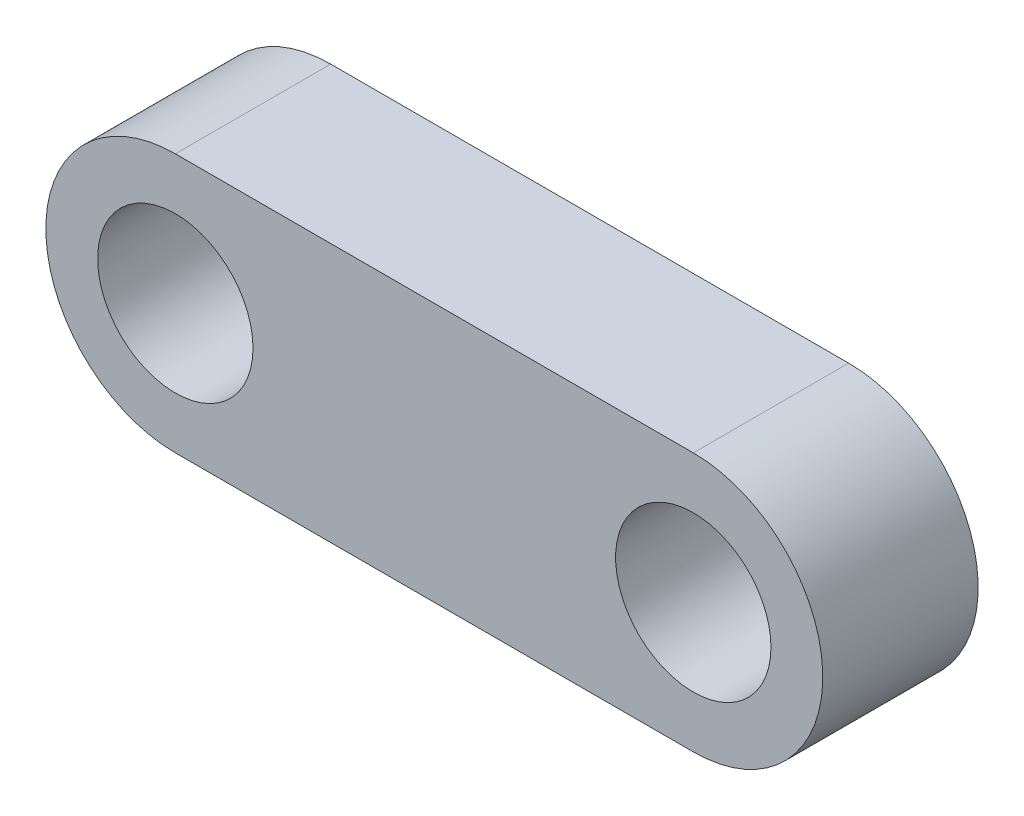
ISO-10303-21;
HEADER;
FILE_DESCRIPTION(('STEP AP214'),'2;1');
FILE_NAME('part.step','',(''),(''),'','','');
FILE_SCHEMA(('AUTOMOTIVE_DESIGN { 1 0 10303 214 1 1 1 1 }'));
ENDSEC;
DATA;
#1=APPLICATION_CONTEXT('core data for automotive mechanical design processes');
#2=APPLICATION_PROTOCOL_DEFINITION('international standard','automotive_design',2000,#1);
#3=PRODUCT_CONTEXT('',#1,'mechanical');
#4=PRODUCT('Part','Part','',(#3));
#5=PRODUCT_RELATED_PRODUCT_CATEGORY('part','',(#4));
#6=PRODUCT_DEFINITION_FORMATION('','',#4);
#7=PRODUCT_DEFINITION_CONTEXT('part definition',#1,'design');
#8=PRODUCT_DEFINITION('design','',#6,#7);
#9=PRODUCT_DEFINITION_SHAPE('','',#8);
#10=(LENGTH_UNIT() NAMED_UNIT(*) SI_UNIT(.MILLI.,.METRE.));
#11=(NAMED_UNIT(*) PLANE_ANGLE_UNIT() SI_UNIT($,.RADIAN.));
#12=(NAMED_UNIT(*) SI_UNIT($,.STERADIAN.) SOLID_ANGLE_UNIT());
#13=UNCERTAINTY_MEASURE_WITH_UNIT(LENGTH_MEASURE(1.E-05),#10,'distance_accuracy_value','');
#14=(GEOMETRIC_REPRESENTATION_CONTEXT(3) GLOBAL_UNCERTAINTY_ASSIGNED_CONTEXT((#13)) GLOBAL_UNIT_ASSIGNED_CONTEXT((#10,
#11,#12)) REPRESENTATION_CONTEXT('',''));
#15=CARTESIAN_POINT('',(0.,0.,0.));
#16=DIRECTION('',(0.,0.,1.));
#17=DIRECTION('',(1.,0.,0.));
#18=AXIS2_PLACEMENT_3D('',#15,#16,#17);
#19=CARTESIAN_POINT('',(-5.,0.,3.));
#20=DIRECTION('',(0.,0.,1.));
#21=DIRECTION('',(1.,0.,0.));
#22=AXIS2_PLACEMENT_3D('',#19,#20,#21);
#23=PLANE('',#22);
#24=CARTESIAN_POINT('',(-5.,0.,3.));
#25=DIRECTION('',(0.,0.,1.));
#26=DIRECTION('',(1.,0.,0.));
#27=AXIS2_PLACEMENT_3D('',#24,#25,#26);
#28=CIRCLE('',#27,1.5);
#29=CARTESIAN_POINT('',(-3.5,0.,3.));
#30=VERTEX_POINT('',#29);
#31=EDGE_CURVE('E112',#30,#30,#28,.T.);
#32=ORIENTED_EDGE('',*,*,#31,.F.);
#33=EDGE_LOOP('',(#32));
#34=FACE_BOUND('',#33,.T.);
#35=CARTESIAN_POINT('',(-5.,0.,3.));
#36=DIRECTION('',(0.,0.,1.));
#37=DIRECTION('',(1.,0.,0.));
#38=AXIS2_PLACEMENT_3D('',#35,#36,#37);
#39=CIRCLE('',#38,2.5);
#40=CARTESIAN_POINT('',(-5.,2.5,3.));
#41=VERTEX_POINT('',#40);
#42=CARTESIAN_POINT('',(-5.,-2.5,3.));
#43=VERTEX_POINT('',#42);
#44=EDGE_CURVE('E92',#41,#43,#39,.T.);
#45=ORIENTED_EDGE('',*,*,#44,.T.);
#46=DIRECTION('',(1.,0.,0.));
#47=VECTOR('',#46,1.);
#48=CARTESIAN_POINT('',(-5.,-2.5,3.));
#49=LINE('',#48,#47);
#50=CARTESIAN_POINT('',(5.,-2.5,3.));
#51=VERTEX_POINT('',#50);
#52=EDGE_CURVE('E87',#43,#51,#49,.T.);
#53=ORIENTED_EDGE('',*,*,#52,.T.);
#54=CARTESIAN_POINT('',(5.,0.,3.));
#55=DIRECTION('',(0.,0.,1.));
#56=DIRECTION('',(1.,0.,0.));
#57=AXIS2_PLACEMENT_3D('',#54,#55,#56);
#58=CIRCLE('',#57,2.5);
#59=CARTESIAN_POINT('',(5.,2.5,3.));
#60=VERTEX_POINT('',#59);
#61=EDGE_CURVE('E90',#51,#60,#58,.T.);
#62=ORIENTED_EDGE('',*,*,#61,.T.);
#63=DIRECTION('',(-1.,0.,0.));
#64=VECTOR('',#63,1.);
#65=CARTESIAN_POINT('',(-5.,2.5,3.));
#66=LINE('',#65,#64);
#67=EDGE_CURVE('E57',#60,#41,#66,.T.);
#68=ORIENTED_EDGE('',*,*,#67,.T.);
#69=EDGE_LOOP('',(#45,#53,#62,#68));
#70=FACE_BOUND('',#69,.T.);
#71=CARTESIAN_POINT('',(5.,0.,3.));
#72=DIRECTION('',(0.,0.,1.));
#73=DIRECTION('',(1.,0.,0.));
#74=AXIS2_PLACEMENT_3D('',#71,#72,#73);
#75=CIRCLE('',#74,1.5);
#76=CARTESIAN_POINT('',(6.5,0.,3.));
#77=VERTEX_POINT('',#76);
#78=EDGE_CURVE('E134',#77,#77,#75,.T.);
#79=ORIENTED_EDGE('',*,*,#78,.F.);
#80=EDGE_LOOP('',(#79));
#81=FACE_BOUND('',#80,.T.);
#82=ADVANCED_FACE('F39',(#34,#70,#81),#23,.T.);
#83=CARTESIAN_POINT('',(-5.,0.,0.));
#84=DIRECTION('',(0.,0.,1.));
#85=DIRECTION('',(1.,0.,0.));
#86=AXIS2_PLACEMENT_3D('',#83,#84,#85);
#87=PLANE('',#86);
#88=CARTESIAN_POINT('',(-5.,0.,0.));
#89=DIRECTION('',(0.,0.,1.));
#90=DIRECTION('',(1.,0.,0.));
#91=AXIS2_PLACEMENT_3D('',#88,#89,#90);
#92=CIRCLE('',#91,2.5);
#93=CARTESIAN_POINT('',(-5.,2.5,0.));
#94=VERTEX_POINT('',#93);
#95=CARTESIAN_POINT('',(-5.,-2.5,0.));
#96=VERTEX_POINT('',#95);
#97=EDGE_CURVE('E108',#94,#96,#92,.T.);
#98=ORIENTED_EDGE('',*,*,#97,.F.);
#99=DIRECTION('',(-1.,0.,0.));
#100=VECTOR('',#99,1.);
#101=CARTESIAN_POINT('',(-5.,2.5,0.));
#102=LINE('',#101,#100);
#103=CARTESIAN_POINT('',(5.,2.5,0.));
#104=VERTEX_POINT('',#103);
#105=EDGE_CURVE('E80',#104,#94,#102,.T.);
#106=ORIENTED_EDGE('',*,*,#105,.F.);
#107=CARTESIAN_POINT('',(5.,0.,0.));
#108=DIRECTION('',(0.,0.,1.));
#109=DIRECTION('',(1.,0.,0.));
#110=AXIS2_PLACEMENT_3D('',#107,#108,#109);
#111=CIRCLE('',#110,2.5);
#112=CARTESIAN_POINT('',(5.,-2.5,0.));
#113=VERTEX_POINT('',#112);
#114=EDGE_CURVE('E74',#113,#104,#111,.T.);
#115=ORIENTED_EDGE('',*,*,#114,.F.);
#116=DIRECTION('',(1.,0.,0.));
#117=VECTOR('',#116,1.);
#118=CARTESIAN_POINT('',(-5.,-2.5,0.));
#119=LINE('',#118,#117);
#120=EDGE_CURVE('E97',#96,#113,#119,.T.);
#121=ORIENTED_EDGE('',*,*,#120,.F.);
#122=EDGE_LOOP('',(#98,#106,#115,#121));
#123=FACE_BOUND('',#122,.T.);
#124=CARTESIAN_POINT('',(-5.,0.,0.));
#125=DIRECTION('',(0.,0.,1.));
#126=DIRECTION('',(1.,0.,0.));
#127=AXIS2_PLACEMENT_3D('',#124,#125,#126);
#128=CIRCLE('',#127,1.5);
#129=CARTESIAN_POINT('',(-3.5,0.,0.));
#130=VERTEX_POINT('',#129);
#131=EDGE_CURVE('E130',#130,#130,#128,.T.);
#132=ORIENTED_EDGE('',*,*,#131,.T.);
#133=EDGE_LOOP('',(#132));
#134=FACE_BOUND('',#133,.T.);
#135=CARTESIAN_POINT('',(5.,0.,0.));
#136=DIRECTION('',(0.,0.,1.));
#137=DIRECTION('',(1.,0.,0.));
#138=AXIS2_PLACEMENT_3D('',#135,#136,#137);
#139=CIRCLE('',#138,1.5);
#140=CARTESIAN_POINT('',(6.5,0.,0.));
#141=VERTEX_POINT('',#140);
#142=EDGE_CURVE('E138',#141,#141,#139,.T.);
#143=ORIENTED_EDGE('',*,*,#142,.T.);
#144=EDGE_LOOP('',(#143));
#145=FACE_BOUND('',#144,.T.);
#146=ADVANCED_FACE('F125',(#123,#134,#145),#87,.F.);
#147=CARTESIAN_POINT('',(-5.,0.,3.));
#148=DIRECTION('',(0.,0.,-1.));
#149=DIRECTION('',(-1.,0.,0.));
#150=AXIS2_PLACEMENT_3D('',#147,#148,#149);
#151=CYLINDRICAL_SURFACE('',#150,2.5);
#152=ORIENTED_EDGE('',*,*,#97,.T.);
#153=DIRECTION('',(0.,0.,-1.));
#154=VECTOR('',#153,1.);
#155=CARTESIAN_POINT('',(-5.,-2.5,3.));
#156=LINE('',#155,#154);
#157=EDGE_CURVE('E11',#43,#96,#156,.T.);
#158=ORIENTED_EDGE('',*,*,#157,.F.);
#159=ORIENTED_EDGE('',*,*,#44,.F.);
#160=DIRECTION('',(0.,0.,-1.));
#161=VECTOR('',#160,1.);
#162=CARTESIAN_POINT('',(-5.,2.5,3.));
#163=LINE('',#162,#161);
#164=EDGE_CURVE('E104',#41,#94,#163,.T.);
#165=ORIENTED_EDGE('',*,*,#164,.T.);
#166=EDGE_LOOP('',(#152,#158,#159,#165));
#167=FACE_BOUND('',#166,.T.);
#168=ADVANCED_FACE('F41',(#167),#151,.T.);
#169=CARTESIAN_POINT('',(-5.,-2.5,3.));
#170=DIRECTION('',(0.,1.,0.));
#171=DIRECTION('',(0.,0.,1.));
#172=AXIS2_PLACEMENT_3D('',#169,#170,#171);
#173=PLANE('',#172);
#174=ORIENTED_EDGE('',*,*,#120,.T.);
#175=DIRECTION('',(0.,0.,-1.));
#176=VECTOR('',#175,1.);
#177=CARTESIAN_POINT('',(5.,-2.5,3.));
#178=LINE('',#177,#176);
#179=EDGE_CURVE('E49',#51,#113,#178,.T.);
#180=ORIENTED_EDGE('',*,*,#179,.F.);
#181=ORIENTED_EDGE('',*,*,#52,.F.);
#182=ORIENTED_EDGE('',*,*,#157,.T.);
#183=EDGE_LOOP('',(#174,#180,#181,#182));
#184=FACE_BOUND('',#183,.T.);
#185=ADVANCED_FACE('F96',(#184),#173,.F.);
#186=CARTESIAN_POINT('',(5.,0.,3.));
#187=DIRECTION('',(0.,0.,-1.));
#188=DIRECTION('',(-1.,0.,0.));
#189=AXIS2_PLACEMENT_3D('',#186,#187,#188);
#190=CYLINDRICAL_SURFACE('',#189,2.5);
#191=ORIENTED_EDGE('',*,*,#114,.T.);
#192=DIRECTION('',(0.,0.,-1.));
#193=VECTOR('',#192,1.);
#194=CARTESIAN_POINT('',(5.,2.5,3.));
#195=LINE('',#194,#193);
#196=EDGE_CURVE('E99',#60,#104,#195,.T.);
#197=ORIENTED_EDGE('',*,*,#196,.F.);
#198=ORIENTED_EDGE('',*,*,#61,.F.);
#199=ORIENTED_EDGE('',*,*,#179,.T.);
#200=EDGE_LOOP('',(#191,#197,#198,#199));
#201=FACE_BOUND('',#200,.T.);
#202=ADVANCED_FACE('F100',(#201),#190,.T.);
#203=CARTESIAN_POINT('',(-5.,2.5,3.));
#204=DIRECTION('',(0.,-1.,0.));
#205=DIRECTION('',(0.,0.,-1.));
#206=AXIS2_PLACEMENT_3D('',#203,#204,#205);
#207=PLANE('',#206);
#208=ORIENTED_EDGE('',*,*,#105,.T.);
#209=ORIENTED_EDGE('',*,*,#164,.F.);
#210=ORIENTED_EDGE('',*,*,#67,.F.);
#211=ORIENTED_EDGE('',*,*,#196,.T.);
#212=EDGE_LOOP('',(#208,#209,#210,#211));
#213=FACE_BOUND('',#212,.T.);
#214=ADVANCED_FACE('F122',(#213),#207,.F.);
#215=CARTESIAN_POINT('',(-5.,0.,3.));
#216=DIRECTION('',(0.,0.,-1.));
#217=DIRECTION('',(-1.,0.,0.));
#218=AXIS2_PLACEMENT_3D('',#215,#216,#217);
#219=CYLINDRICAL_SURFACE('',#218,1.5);
#220=ORIENTED_EDGE('',*,*,#31,.T.);
#221=EDGE_LOOP('',(#220));
#222=FACE_BOUND('',#221,.T.);
#223=ORIENTED_EDGE('',*,*,#131,.F.);
#224=EDGE_LOOP('',(#223));
#225=FACE_BOUND('',#224,.T.);
#226=ADVANCED_FACE('F157',(#222,#225),#219,.F.);
#227=CARTESIAN_POINT('',(5.,0.,3.));
#228=DIRECTION('',(0.,0.,-1.));
#229=DIRECTION('',(-1.,0.,0.));
#230=AXIS2_PLACEMENT_3D('',#227,#228,#229);
#231=CYLINDRICAL_SURFACE('',#230,1.5);
#232=ORIENTED_EDGE('',*,*,#78,.T.);
#233=EDGE_LOOP('',(#232));
#234=FACE_BOUND('',#233,.T.);
#235=ORIENTED_EDGE('',*,*,#142,.F.);
#236=EDGE_LOOP('',(#235));
#237=FACE_BOUND('',#236,.T.);
#238=ADVANCED_FACE('F146',(#234,#237),#231,.F.);
#239=CLOSED_SHELL('',(#82,#146,#168,#185,#202,#214,#226,#238));
#240=MANIFOLD_SOLID_BREP('B2',#239);
#241=ADVANCED_BREP_SHAPE_REPRESENTATION('',(#18,#240),#14);
#242=SHAPE_DEFINITION_REPRESENTATION(#9,#241);
ENDSEC;
END-ISO-10303-21;
